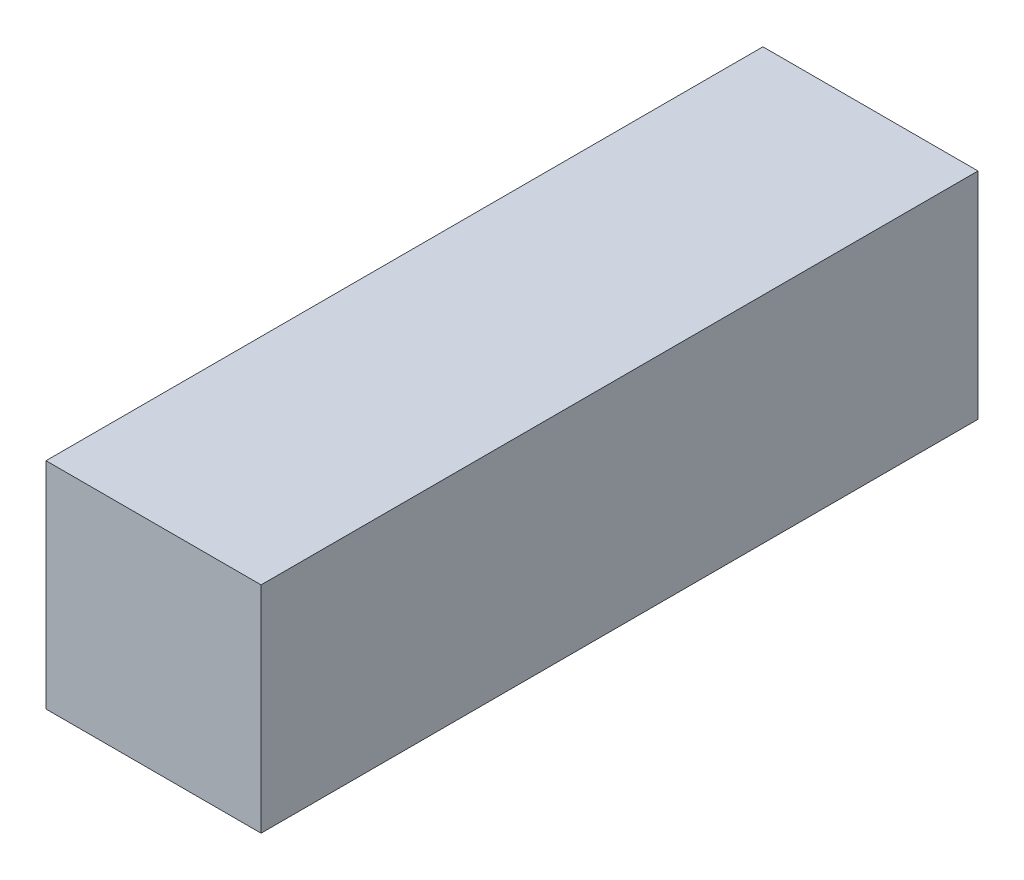
ISO-10303-21;
HEADER;
FILE_DESCRIPTION(('STEP AP214'),'2;1');
FILE_NAME('part.step','',(''),(''),'','','');
FILE_SCHEMA(('AUTOMOTIVE_DESIGN { 1 0 10303 214 1 1 1 1 }'));
ENDSEC;
DATA;
#1=APPLICATION_CONTEXT('core data for automotive mechanical design processes');
#2=APPLICATION_PROTOCOL_DEFINITION('international standard','automotive_design',2000,#1);
#3=PRODUCT_CONTEXT('',#1,'mechanical');
#4=PRODUCT('Part','Part','',(#3));
#5=PRODUCT_RELATED_PRODUCT_CATEGORY('part','',(#4));
#6=PRODUCT_DEFINITION_FORMATION('','',#4);
#7=PRODUCT_DEFINITION_CONTEXT('part definition',#1,'design');
#8=PRODUCT_DEFINITION('design','',#6,#7);
#9=PRODUCT_DEFINITION_SHAPE('','',#8);
#10=(LENGTH_UNIT() NAMED_UNIT(*) SI_UNIT(.MILLI.,.METRE.));
#11=(NAMED_UNIT(*) PLANE_ANGLE_UNIT() SI_UNIT($,.RADIAN.));
#12=(NAMED_UNIT(*) SI_UNIT($,.STERADIAN.) SOLID_ANGLE_UNIT());
#13=UNCERTAINTY_MEASURE_WITH_UNIT(LENGTH_MEASURE(1.E-05),#10,'distance_accuracy_value','');
#14=(GEOMETRIC_REPRESENTATION_CONTEXT(3) GLOBAL_UNCERTAINTY_ASSIGNED_CONTEXT((#13)) GLOBAL_UNIT_ASSIGNED_CONTEXT((#10,
#11,#12)) REPRESENTATION_CONTEXT('',''));
#15=CARTESIAN_POINT('',(0.,0.,0.));
#16=DIRECTION('',(0.,0.,1.));
#17=DIRECTION('',(1.,0.,0.));
#18=AXIS2_PLACEMENT_3D('',#15,#16,#17);
#19=CARTESIAN_POINT('',(-3.00000000000001,13.4,20.));
#20=DIRECTION('',(1.,0.,0.));
#21=DIRECTION('',(0.,1.,0.));
#22=AXIS2_PLACEMENT_3D('',#19,#20,#21);
#23=PLANE('',#22);
#24=DIRECTION('',(0.,-1.,0.));
#25=VECTOR('',#24,1.);
#26=CARTESIAN_POINT('',(-3.00000000000001,13.4,0.));
#27=LINE('',#26,#25);
#28=CARTESIAN_POINT('',(-3.00000000000001,13.4,0.));
#29=VERTEX_POINT('',#28);
#30=CARTESIAN_POINT('',(-3.00000000000001,7.4,0.));
#31=VERTEX_POINT('',#30);
#32=EDGE_CURVE('E104',#29,#31,#27,.T.);
#33=ORIENTED_EDGE('',*,*,#32,.T.);
#34=DIRECTION('',(0.,0.,-1.));
#35=VECTOR('',#34,1.);
#36=CARTESIAN_POINT('',(-3.00000000000001,7.4,20.));
#37=LINE('',#36,#35);
#38=CARTESIAN_POINT('',(-3.00000000000001,7.4,20.));
#39=VERTEX_POINT('',#38);
#40=EDGE_CURVE('E11',#39,#31,#37,.T.);
#41=ORIENTED_EDGE('',*,*,#40,.F.);
#42=DIRECTION('',(0.,-1.,0.));
#43=VECTOR('',#42,1.);
#44=CARTESIAN_POINT('',(-3.00000000000001,13.4,20.));
#45=LINE('',#44,#43);
#46=CARTESIAN_POINT('',(-3.00000000000001,13.4,20.));
#47=VERTEX_POINT('',#46);
#48=EDGE_CURVE('E92',#47,#39,#45,.T.);
#49=ORIENTED_EDGE('',*,*,#48,.F.);
#50=DIRECTION('',(0.,0.,-1.));
#51=VECTOR('',#50,1.);
#52=CARTESIAN_POINT('',(-3.00000000000001,13.4,20.));
#53=LINE('',#52,#51);
#54=EDGE_CURVE('E99',#47,#29,#53,.T.);
#55=ORIENTED_EDGE('',*,*,#54,.T.);
#56=EDGE_LOOP('',(#33,#41,#49,#55));
#57=FACE_BOUND('',#56,.T.);
#58=ADVANCED_FACE('F41',(#57),#23,.F.);
#59=CARTESIAN_POINT('',(-3.00000000000001,7.4,20.));
#60=DIRECTION('',(0.,1.,0.));
#61=DIRECTION('',(0.,0.,1.));
#62=AXIS2_PLACEMENT_3D('',#59,#60,#61);
#63=PLANE('',#62);
#64=DIRECTION('',(1.,0.,0.));
#65=VECTOR('',#64,1.);
#66=CARTESIAN_POINT('',(-3.00000000000001,7.4,0.));
#67=LINE('',#66,#65);
#68=CARTESIAN_POINT('',(3.,7.4,0.));
#69=VERTEX_POINT('',#68);
#70=EDGE_CURVE('E98',#31,#69,#67,.T.);
#71=ORIENTED_EDGE('',*,*,#70,.T.);
#72=DIRECTION('',(0.,0.,-1.));
#73=VECTOR('',#72,1.);
#74=CARTESIAN_POINT('',(3.,7.4,20.));
#75=LINE('',#74,#73);
#76=CARTESIAN_POINT('',(3.,7.4,20.));
#77=VERTEX_POINT('',#76);
#78=EDGE_CURVE('E47',#77,#69,#75,.T.);
#79=ORIENTED_EDGE('',*,*,#78,.F.);
#80=DIRECTION('',(1.,0.,0.));
#81=VECTOR('',#80,1.);
#82=CARTESIAN_POINT('',(-3.00000000000001,7.4,20.));
#83=LINE('',#82,#81);
#84=EDGE_CURVE('E90',#39,#77,#83,.T.);
#85=ORIENTED_EDGE('',*,*,#84,.F.);
#86=ORIENTED_EDGE('',*,*,#40,.T.);
#87=EDGE_LOOP('',(#71,#79,#85,#86));
#88=FACE_BOUND('',#87,.T.);
#89=ADVANCED_FACE('F95',(#88),#63,.F.);
#90=CARTESIAN_POINT('',(3.,13.4,20.));
#91=DIRECTION('',(-1.,0.,0.));
#92=DIRECTION('',(0.,0.,1.));
#93=AXIS2_PLACEMENT_3D('',#90,#91,#92);
#94=PLANE('',#93);
#95=DIRECTION('',(0.,1.,0.));
#96=VECTOR('',#95,1.);
#97=CARTESIAN_POINT('',(3.,13.4,0.));
#98=LINE('',#97,#96);
#99=CARTESIAN_POINT('',(3.,13.4,0.));
#100=VERTEX_POINT('',#99);
#101=EDGE_CURVE('E73',#69,#100,#98,.T.);
#102=ORIENTED_EDGE('',*,*,#101,.T.);
#103=DIRECTION('',(0.,0.,-1.));
#104=VECTOR('',#103,1.);
#105=CARTESIAN_POINT('',(3.,13.4,20.));
#106=LINE('',#105,#104);
#107=CARTESIAN_POINT('',(3.,13.4,20.));
#108=VERTEX_POINT('',#107);
#109=EDGE_CURVE('E97',#108,#100,#106,.T.);
#110=ORIENTED_EDGE('',*,*,#109,.F.);
#111=DIRECTION('',(0.,1.,0.));
#112=VECTOR('',#111,1.);
#113=CARTESIAN_POINT('',(3.,13.4,20.));
#114=LINE('',#113,#112);
#115=EDGE_CURVE('E88',#77,#108,#114,.T.);
#116=ORIENTED_EDGE('',*,*,#115,.F.);
#117=ORIENTED_EDGE('',*,*,#78,.T.);
#118=EDGE_LOOP('',(#102,#110,#116,#117));
#119=FACE_BOUND('',#118,.T.);
#120=ADVANCED_FACE('F96',(#119),#94,.F.);
#121=CARTESIAN_POINT('',(-3.00000000000001,13.4,20.));
#122=DIRECTION('',(0.,-1.,0.));
#123=DIRECTION('',(0.,0.,-1.));
#124=AXIS2_PLACEMENT_3D('',#121,#122,#123);
#125=PLANE('',#124);
#126=DIRECTION('',(-1.,0.,0.));
#127=VECTOR('',#126,1.);
#128=CARTESIAN_POINT('',(-3.00000000000001,13.4,0.));
#129=LINE('',#128,#127);
#130=EDGE_CURVE('E78',#100,#29,#129,.T.);
#131=ORIENTED_EDGE('',*,*,#130,.T.);
#132=ORIENTED_EDGE('',*,*,#54,.F.);
#133=DIRECTION('',(-1.,0.,0.));
#134=VECTOR('',#133,1.);
#135=CARTESIAN_POINT('',(-3.00000000000001,13.4,20.));
#136=LINE('',#135,#134);
#137=EDGE_CURVE('E60',#108,#47,#136,.T.);
#138=ORIENTED_EDGE('',*,*,#137,.F.);
#139=ORIENTED_EDGE('',*,*,#109,.T.);
#140=EDGE_LOOP('',(#131,#132,#138,#139));
#141=FACE_BOUND('',#140,.T.);
#142=ADVANCED_FACE('F111',(#141),#125,.F.);
#143=CARTESIAN_POINT('',(0.,0.,20.));
#144=DIRECTION('',(0.,0.,1.));
#145=DIRECTION('',(1.,0.,0.));
#146=AXIS2_PLACEMENT_3D('',#143,#144,#145);
#147=PLANE('',#146);
#148=ORIENTED_EDGE('',*,*,#48,.T.);
#149=ORIENTED_EDGE('',*,*,#84,.T.);
#150=ORIENTED_EDGE('',*,*,#115,.T.);
#151=ORIENTED_EDGE('',*,*,#137,.T.);
#152=EDGE_LOOP('',(#148,#149,#150,#151));
#153=FACE_BOUND('',#152,.T.);
#154=ADVANCED_FACE('F89',(#153),#147,.T.);
#155=CARTESIAN_POINT('',(0.,0.,0.));
#156=DIRECTION('',(0.,0.,1.));
#157=DIRECTION('',(1.,0.,0.));
#158=AXIS2_PLACEMENT_3D('',#155,#156,#157);
#159=PLANE('',#158);
#160=ORIENTED_EDGE('',*,*,#32,.F.);
#161=ORIENTED_EDGE('',*,*,#130,.F.);
#162=ORIENTED_EDGE('',*,*,#101,.F.);
#163=ORIENTED_EDGE('',*,*,#70,.F.);
#164=EDGE_LOOP('',(#160,#161,#162,#163));
#165=FACE_BOUND('',#164,.T.);
#166=ADVANCED_FACE('F112',(#165),#159,.F.);
#167=CLOSED_SHELL('',(#58,#89,#120,#142,#154,#166));
#168=MANIFOLD_SOLID_BREP('B2',#167);
#169=ADVANCED_BREP_SHAPE_REPRESENTATION('',(#18,#168),#14);
#170=SHAPE_DEFINITION_REPRESENTATION(#9,#169);
ENDSEC;
END-ISO-10303-21;
